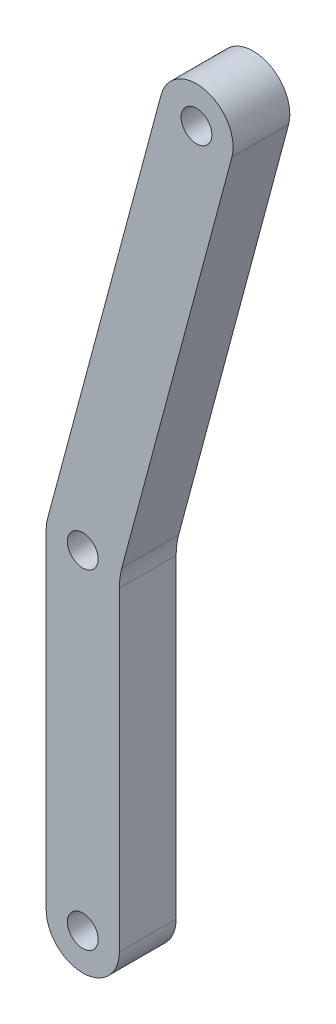
ISO-10303-21;
HEADER;
FILE_DESCRIPTION(('STEP AP214'),'2;1');
FILE_NAME('part.step','',(''),(''),'','','');
FILE_SCHEMA(('AUTOMOTIVE_DESIGN { 1 0 10303 214 1 1 1 1 }'));
ENDSEC;
DATA;
#1=APPLICATION_CONTEXT('core data for automotive mechanical design processes');
#2=APPLICATION_PROTOCOL_DEFINITION('international standard','automotive_design',2000,#1);
#3=PRODUCT_CONTEXT('',#1,'mechanical');
#4=PRODUCT('Part','Part','',(#3));
#5=PRODUCT_RELATED_PRODUCT_CATEGORY('part','',(#4));
#6=PRODUCT_DEFINITION_FORMATION('','',#4);
#7=PRODUCT_DEFINITION_CONTEXT('part definition',#1,'design');
#8=PRODUCT_DEFINITION('design','',#6,#7);
#9=PRODUCT_DEFINITION_SHAPE('','',#8);
#10=(LENGTH_UNIT() NAMED_UNIT(*) SI_UNIT(.MILLI.,.METRE.));
#11=(NAMED_UNIT(*) PLANE_ANGLE_UNIT() SI_UNIT($,.RADIAN.));
#12=(NAMED_UNIT(*) SI_UNIT($,.STERADIAN.) SOLID_ANGLE_UNIT());
#13=UNCERTAINTY_MEASURE_WITH_UNIT(LENGTH_MEASURE(1.E-05),#10,'distance_accuracy_value','');
#14=(GEOMETRIC_REPRESENTATION_CONTEXT(3) GLOBAL_UNCERTAINTY_ASSIGNED_CONTEXT((#13)) GLOBAL_UNIT_ASSIGNED_CONTEXT((#10,
#11,#12)) REPRESENTATION_CONTEXT('',''));
#15=CARTESIAN_POINT('',(0.,0.,0.));
#16=DIRECTION('',(0.,0.,1.));
#17=DIRECTION('',(1.,0.,0.));
#18=AXIS2_PLACEMENT_3D('',#15,#16,#17);
#19=CARTESIAN_POINT('',(-16.0796291314454,4.30852364036275,7.75));
#20=DIRECTION('',(-0.965925826289068,0.258819045102521,0.));
#21=DIRECTION('',(-0.258819045102521,-0.965925826289068,0.));
#22=AXIS2_PLACEMENT_3D('',#19,#20,#21);
#23=PLANE('',#22);
#24=DIRECTION('',(0.258819045102521,0.965925826289068,0.));
#25=VECTOR('',#24,1.);
#26=CARTESIAN_POINT('',(-16.0796291314454,4.30852364036275,0.));
#27=LINE('',#26,#25);
#28=CARTESIAN_POINT('',(-4.82962913144534,46.2940952255126,0.));
#29=VERTEX_POINT('',#28);
#30=CARTESIAN_POINT('',(10.6995135747059,104.249644802857,0.));
#31=VERTEX_POINT('',#30);
#32=EDGE_CURVE('E112',#29,#31,#27,.T.);
#33=ORIENTED_EDGE('',*,*,#32,.F.);
#34=DIRECTION('',(0.,0.,-1.));
#35=VECTOR('',#34,1.);
#36=CARTESIAN_POINT('',(-4.82962913144534,46.2940952255126,7.75));
#37=LINE('',#36,#35);
#38=CARTESIAN_POINT('',(-4.82962913144534,46.2940952255126,7.75));
#39=VERTEX_POINT('',#38);
#40=EDGE_CURVE('E107',#39,#29,#37,.T.);
#41=ORIENTED_EDGE('',*,*,#40,.F.);
#42=DIRECTION('',(0.258819045102521,0.965925826289068,0.));
#43=VECTOR('',#42,1.);
#44=CARTESIAN_POINT('',(-16.0796291314454,4.30852364036275,7.75));
#45=LINE('',#44,#43);
#46=CARTESIAN_POINT('',(10.6995135747059,104.249644802857,7.75));
#47=VERTEX_POINT('',#46);
#48=EDGE_CURVE('E110',#39,#47,#45,.T.);
#49=ORIENTED_EDGE('',*,*,#48,.T.);
#50=DIRECTION('',(0.,0.,-1.));
#51=VECTOR('',#50,1.);
#52=CARTESIAN_POINT('',(10.6995135747059,104.249644802857,7.75));
#53=LINE('',#52,#51);
#54=EDGE_CURVE('E167',#47,#31,#53,.T.);
#55=ORIENTED_EDGE('',*,*,#54,.T.);
#56=EDGE_LOOP('',(#33,#41,#49,#55));
#57=FACE_BOUND('',#56,.T.);
#58=ADVANCED_FACE('F41',(#57),#23,.T.);
#59=CARTESIAN_POINT('',(0.,45.,7.75));
#60=DIRECTION('',(0.,0.,-1.));
#61=DIRECTION('',(-1.,0.,0.));
#62=AXIS2_PLACEMENT_3D('',#59,#60,#61);
#63=CYLINDRICAL_SURFACE('',#62,5.);
#64=CARTESIAN_POINT('',(0.,45.,0.));
#65=DIRECTION('',(0.,0.,1.));
#66=DIRECTION('',(1.,0.,0.));
#67=AXIS2_PLACEMENT_3D('',#64,#65,#66);
#68=CIRCLE('',#67,5.);
#69=CARTESIAN_POINT('',(-5.,45.,0.));
#70=VERTEX_POINT('',#69);
#71=EDGE_CURVE('E170',#29,#70,#68,.T.);
#72=ORIENTED_EDGE('',*,*,#71,.T.);
#73=DIRECTION('',(0.,0.,-1.));
#74=VECTOR('',#73,1.);
#75=CARTESIAN_POINT('',(-5.,45.,7.75));
#76=LINE('',#75,#74);
#77=CARTESIAN_POINT('',(-5.,45.,7.75));
#78=VERTEX_POINT('',#77);
#79=EDGE_CURVE('E118',#78,#70,#76,.T.);
#80=ORIENTED_EDGE('',*,*,#79,.F.);
#81=CARTESIAN_POINT('',(0.,45.,7.75));
#82=DIRECTION('',(0.,0.,1.));
#83=DIRECTION('',(1.,0.,0.));
#84=AXIS2_PLACEMENT_3D('',#81,#82,#83);
#85=CIRCLE('',#84,5.);
#86=EDGE_CURVE('E121',#39,#78,#85,.T.);
#87=ORIENTED_EDGE('',*,*,#86,.F.);
#88=ORIENTED_EDGE('',*,*,#40,.T.);
#89=EDGE_LOOP('',(#72,#80,#87,#88));
#90=FACE_BOUND('',#89,.T.);
#91=ADVANCED_FACE('F122',(#90),#63,.T.);
#92=CARTESIAN_POINT('',(-5.,0.,7.75));
#93=DIRECTION('',(-1.,0.,0.));
#94=DIRECTION('',(0.,0.,1.));
#95=AXIS2_PLACEMENT_3D('',#92,#93,#94);
#96=PLANE('',#95);
#97=DIRECTION('',(0.,1.,0.));
#98=VECTOR('',#97,1.);
#99=CARTESIAN_POINT('',(-5.,0.,0.));
#100=LINE('',#99,#98);
#101=CARTESIAN_POINT('',(-5.,0.,0.));
#102=VERTEX_POINT('',#101);
#103=EDGE_CURVE('E173',#102,#70,#100,.T.);
#104=ORIENTED_EDGE('',*,*,#103,.F.);
#105=DIRECTION('',(0.,0.,-1.));
#106=VECTOR('',#105,1.);
#107=CARTESIAN_POINT('',(-5.,0.,7.75));
#108=LINE('',#107,#106);
#109=CARTESIAN_POINT('',(-5.,0.,7.75));
#110=VERTEX_POINT('',#109);
#111=EDGE_CURVE('E207',#110,#102,#108,.T.);
#112=ORIENTED_EDGE('',*,*,#111,.F.);
#113=DIRECTION('',(0.,1.,0.));
#114=VECTOR('',#113,1.);
#115=CARTESIAN_POINT('',(-5.,0.,7.75));
#116=LINE('',#115,#114);
#117=EDGE_CURVE('E127',#110,#78,#116,.T.);
#118=ORIENTED_EDGE('',*,*,#117,.T.);
#119=ORIENTED_EDGE('',*,*,#79,.T.);
#120=EDGE_LOOP('',(#104,#112,#118,#119));
#121=FACE_BOUND('',#120,.T.);
#122=ADVANCED_FACE('F247',(#121),#96,.T.);
#123=CARTESIAN_POINT('',(0.,0.,7.75));
#124=DIRECTION('',(0.,0.,-1.));
#125=DIRECTION('',(-1.,0.,0.));
#126=AXIS2_PLACEMENT_3D('',#123,#124,#125);
#127=CYLINDRICAL_SURFACE('',#126,5.);
#128=CARTESIAN_POINT('',(0.,0.,0.));
#129=DIRECTION('',(0.,0.,1.));
#130=DIRECTION('',(1.,0.,0.));
#131=AXIS2_PLACEMENT_3D('',#128,#129,#130);
#132=CIRCLE('',#131,5.);
#133=CARTESIAN_POINT('',(5.,0.,0.));
#134=VERTEX_POINT('',#133);
#135=EDGE_CURVE('E177',#102,#134,#132,.T.);
#136=ORIENTED_EDGE('',*,*,#135,.T.);
#137=DIRECTION('',(0.,0.,-1.));
#138=VECTOR('',#137,1.);
#139=CARTESIAN_POINT('',(5.,0.,7.75));
#140=LINE('',#139,#138);
#141=CARTESIAN_POINT('',(5.,0.,7.75));
#142=VERTEX_POINT('',#141);
#143=EDGE_CURVE('E203',#142,#134,#140,.T.);
#144=ORIENTED_EDGE('',*,*,#143,.F.);
#145=CARTESIAN_POINT('',(0.,0.,7.75));
#146=DIRECTION('',(0.,0.,1.));
#147=DIRECTION('',(1.,0.,0.));
#148=AXIS2_PLACEMENT_3D('',#145,#146,#147);
#149=CIRCLE('',#148,5.);
#150=EDGE_CURVE('E144',#110,#142,#149,.T.);
#151=ORIENTED_EDGE('',*,*,#150,.F.);
#152=ORIENTED_EDGE('',*,*,#111,.T.);
#153=EDGE_LOOP('',(#136,#144,#151,#152));
#154=FACE_BOUND('',#153,.T.);
#155=ADVANCED_FACE('F252',(#154),#127,.T.);
#156=CARTESIAN_POINT('',(5.,0.,7.75));
#157=DIRECTION('',(-1.,0.,0.));
#158=DIRECTION('',(0.,0.,1.));
#159=AXIS2_PLACEMENT_3D('',#156,#157,#158);
#160=PLANE('',#159);
#161=DIRECTION('',(0.,1.,0.));
#162=VECTOR('',#161,1.);
#163=CARTESIAN_POINT('',(5.,0.,0.));
#164=LINE('',#163,#162);
#165=CARTESIAN_POINT('',(5.,43.0252125361891,0.));
#166=VERTEX_POINT('',#165);
#167=EDGE_CURVE('E180',#134,#166,#164,.T.);
#168=ORIENTED_EDGE('',*,*,#167,.T.);
#169=DIRECTION('',(0.,0.,-1.));
#170=VECTOR('',#169,1.);
#171=CARTESIAN_POINT('',(5.,43.0252125361891,7.75));
#172=LINE('',#171,#170);
#173=CARTESIAN_POINT('',(5.,43.0252125361891,7.75));
#174=VERTEX_POINT('',#173);
#175=EDGE_CURVE('E57',#166,#174,#172,.F.);
#176=ORIENTED_EDGE('',*,*,#175,.T.);
#177=DIRECTION('',(0.,1.,0.));
#178=VECTOR('',#177,1.);
#179=CARTESIAN_POINT('',(5.,0.,7.75));
#180=LINE('',#179,#178);
#181=EDGE_CURVE('E147',#142,#174,#180,.T.);
#182=ORIENTED_EDGE('',*,*,#181,.F.);
#183=ORIENTED_EDGE('',*,*,#143,.T.);
#184=EDGE_LOOP('',(#168,#176,#182,#183));
#185=FACE_BOUND('',#184,.T.);
#186=ADVANCED_FACE('F256',(#185),#160,.F.);
#187=CARTESIAN_POINT('',(-6.42037086855468,1.72033318933754,7.75));
#188=DIRECTION('',(-0.965925826289068,0.258819045102521,0.));
#189=DIRECTION('',(-0.258819045102521,-0.965925826289068,0.));
#190=AXIS2_PLACEMENT_3D('',#187,#188,#189);
#191=PLANE('',#190);
#192=DIRECTION('',(0.258819045102521,0.965925826289068,0.));
#193=VECTOR('',#192,1.);
#194=CARTESIAN_POINT('',(-6.42037086855468,1.72033318933754,7.75));
#195=LINE('',#194,#193);
#196=CARTESIAN_POINT('',(5.34074173710932,45.6134029872143,7.75));
#197=VERTEX_POINT('',#196);
#198=CARTESIAN_POINT('',(20.3587718375966,101.661454351832,7.75));
#199=VERTEX_POINT('',#198);
#200=EDGE_CURVE('E150',#197,#199,#195,.T.);
#201=ORIENTED_EDGE('',*,*,#200,.F.);
#202=DIRECTION('',(0.,0.,-1.));
#203=VECTOR('',#202,1.);
#204=CARTESIAN_POINT('',(5.34074173710932,45.6134029872143,0.));
#205=LINE('',#204,#203);
#206=CARTESIAN_POINT('',(5.34074173710932,45.6134029872143,0.));
#207=VERTEX_POINT('',#206);
#208=EDGE_CURVE('E117',#197,#207,#205,.T.);
#209=ORIENTED_EDGE('',*,*,#208,.T.);
#210=DIRECTION('',(0.258819045102521,0.965925826289068,0.));
#211=VECTOR('',#210,1.);
#212=CARTESIAN_POINT('',(-6.42037086855468,1.72033318933754,0.));
#213=LINE('',#212,#211);
#214=CARTESIAN_POINT('',(20.3587718375966,101.661454351832,0.));
#215=VERTEX_POINT('',#214);
#216=EDGE_CURVE('E183',#207,#215,#213,.T.);
#217=ORIENTED_EDGE('',*,*,#216,.T.);
#218=DIRECTION('',(0.,0.,-1.));
#219=VECTOR('',#218,1.);
#220=CARTESIAN_POINT('',(20.3587718375966,101.661454351832,7.75));
#221=LINE('',#220,#219);
#222=EDGE_CURVE('E199',#199,#215,#221,.T.);
#223=ORIENTED_EDGE('',*,*,#222,.F.);
#224=EDGE_LOOP('',(#201,#209,#217,#223));
#225=FACE_BOUND('',#224,.T.);
#226=ADVANCED_FACE('F220',(#225),#191,.F.);
#227=CARTESIAN_POINT('',(0.,45.,7.75));
#228=DIRECTION('',(0.,0.,-1.));
#229=DIRECTION('',(-1.,0.,0.));
#230=AXIS2_PLACEMENT_3D('',#227,#228,#229);
#231=CYLINDRICAL_SURFACE('',#230,2.1);
#232=CARTESIAN_POINT('',(0.,45.,7.75));
#233=DIRECTION('',(0.,0.,1.));
#234=DIRECTION('',(1.,0.,0.));
#235=AXIS2_PLACEMENT_3D('',#232,#233,#234);
#236=CIRCLE('',#235,2.1);
#237=CARTESIAN_POINT('',(2.1,45.,7.75));
#238=VERTEX_POINT('',#237);
#239=EDGE_CURVE('E159',#238,#238,#236,.T.);
#240=ORIENTED_EDGE('',*,*,#239,.T.);
#241=EDGE_LOOP('',(#240));
#242=FACE_BOUND('',#241,.T.);
#243=CARTESIAN_POINT('',(0.,45.,0.));
#244=DIRECTION('',(0.,0.,1.));
#245=DIRECTION('',(1.,0.,0.));
#246=AXIS2_PLACEMENT_3D('',#243,#244,#245);
#247=CIRCLE('',#246,2.1);
#248=CARTESIAN_POINT('',(2.1,45.,0.));
#249=VERTEX_POINT('',#248);
#250=EDGE_CURVE('E139',#249,#249,#247,.T.);
#251=ORIENTED_EDGE('',*,*,#250,.F.);
#252=EDGE_LOOP('',(#251));
#253=FACE_BOUND('',#252,.T.);
#254=ADVANCED_FACE('F239',(#242,#253),#231,.F.);
#255=CARTESIAN_POINT('',(15.5291427061513,102.955549577344,7.75));
#256=DIRECTION('',(0.,0.,-1.));
#257=DIRECTION('',(-1.,0.,0.));
#258=AXIS2_PLACEMENT_3D('',#255,#256,#257);
#259=CYLINDRICAL_SURFACE('',#258,2.1);
#260=CARTESIAN_POINT('',(15.5291427061513,102.955549577344,7.75));
#261=DIRECTION('',(0.,0.,1.));
#262=DIRECTION('',(1.,0.,0.));
#263=AXIS2_PLACEMENT_3D('',#260,#261,#262);
#264=CIRCLE('',#263,2.1);
#265=CARTESIAN_POINT('',(17.6291427061513,102.955549577344,7.75));
#266=VERTEX_POINT('',#265);
#267=EDGE_CURVE('E155',#266,#266,#264,.T.);
#268=ORIENTED_EDGE('',*,*,#267,.T.);
#269=EDGE_LOOP('',(#268));
#270=FACE_BOUND('',#269,.T.);
#271=CARTESIAN_POINT('',(15.5291427061513,102.955549577344,0.));
#272=DIRECTION('',(0.,0.,1.));
#273=DIRECTION('',(1.,0.,0.));
#274=AXIS2_PLACEMENT_3D('',#271,#272,#273);
#275=CIRCLE('',#274,2.1);
#276=CARTESIAN_POINT('',(17.6291427061513,102.955549577344,0.));
#277=VERTEX_POINT('',#276);
#278=EDGE_CURVE('E190',#277,#277,#275,.T.);
#279=ORIENTED_EDGE('',*,*,#278,.F.);
#280=EDGE_LOOP('',(#279));
#281=FACE_BOUND('',#280,.T.);
#282=ADVANCED_FACE('F231',(#270,#281),#259,.F.);
#283=CARTESIAN_POINT('',(15.5291427061513,102.955549577344,7.75));
#284=DIRECTION('',(0.,0.,-1.));
#285=DIRECTION('',(-1.,0.,0.));
#286=AXIS2_PLACEMENT_3D('',#283,#284,#285);
#287=CYLINDRICAL_SURFACE('',#286,5.);
#288=CARTESIAN_POINT('',(15.5291427061513,102.955549577344,0.));
#289=DIRECTION('',(0.,0.,1.));
#290=DIRECTION('',(1.,0.,0.));
#291=AXIS2_PLACEMENT_3D('',#288,#289,#290);
#292=CIRCLE('',#291,5.);
#293=EDGE_CURVE('E186',#215,#31,#292,.T.);
#294=ORIENTED_EDGE('',*,*,#293,.T.);
#295=ORIENTED_EDGE('',*,*,#54,.F.);
#296=CARTESIAN_POINT('',(15.5291427061513,102.955549577344,7.75));
#297=DIRECTION('',(0.,0.,1.));
#298=DIRECTION('',(1.,0.,0.));
#299=AXIS2_PLACEMENT_3D('',#296,#297,#298);
#300=CIRCLE('',#299,5.);
#301=EDGE_CURVE('E132',#199,#47,#300,.T.);
#302=ORIENTED_EDGE('',*,*,#301,.F.);
#303=ORIENTED_EDGE('',*,*,#222,.T.);
#304=EDGE_LOOP('',(#294,#295,#302,#303));
#305=FACE_BOUND('',#304,.T.);
#306=ADVANCED_FACE('F228',(#305),#287,.T.);
#307=CARTESIAN_POINT('',(0.,0.,7.75));
#308=DIRECTION('',(0.,0.,-1.));
#309=DIRECTION('',(-1.,0.,0.));
#310=AXIS2_PLACEMENT_3D('',#307,#308,#309);
#311=CYLINDRICAL_SURFACE('',#310,2.1);
#312=CARTESIAN_POINT('',(0.,0.,7.75));
#313=DIRECTION('',(0.,0.,1.));
#314=DIRECTION('',(1.,0.,0.));
#315=AXIS2_PLACEMENT_3D('',#312,#313,#314);
#316=CIRCLE('',#315,2.1);
#317=CARTESIAN_POINT('',(2.1,0.,7.75));
#318=VERTEX_POINT('',#317);
#319=EDGE_CURVE('E163',#318,#318,#316,.T.);
#320=ORIENTED_EDGE('',*,*,#319,.T.);
#321=EDGE_LOOP('',(#320));
#322=FACE_BOUND('',#321,.T.);
#323=CARTESIAN_POINT('',(0.,0.,0.));
#324=DIRECTION('',(0.,0.,1.));
#325=DIRECTION('',(1.,0.,0.));
#326=AXIS2_PLACEMENT_3D('',#323,#324,#325);
#327=CIRCLE('',#326,2.1);
#328=CARTESIAN_POINT('',(2.1,0.,0.));
#329=VERTEX_POINT('',#328);
#330=EDGE_CURVE('E135',#329,#329,#327,.T.);
#331=ORIENTED_EDGE('',*,*,#330,.F.);
#332=EDGE_LOOP('',(#331));
#333=FACE_BOUND('',#332,.T.);
#334=ADVANCED_FACE('F230',(#322,#333),#311,.F.);
#335=CARTESIAN_POINT('',(0.,0.,7.75));
#336=DIRECTION('',(0.,0.,1.));
#337=DIRECTION('',(1.,0.,0.));
#338=AXIS2_PLACEMENT_3D('',#335,#336,#337);
#339=PLANE('',#338);
#340=ORIENTED_EDGE('',*,*,#48,.F.);
#341=ORIENTED_EDGE('',*,*,#86,.T.);
#342=ORIENTED_EDGE('',*,*,#117,.F.);
#343=ORIENTED_EDGE('',*,*,#150,.T.);
#344=ORIENTED_EDGE('',*,*,#181,.T.);
#345=CARTESIAN_POINT('',(15.,43.0252125361891,7.75));
#346=DIRECTION('',(0.,0.,1.));
#347=DIRECTION('',(1.,0.,0.));
#348=AXIS2_PLACEMENT_3D('',#345,#346,#347);
#349=CIRCLE('',#348,10.);
#350=EDGE_CURVE('E11',#174,#197,#349,.F.);
#351=ORIENTED_EDGE('',*,*,#350,.T.);
#352=ORIENTED_EDGE('',*,*,#200,.T.);
#353=ORIENTED_EDGE('',*,*,#301,.T.);
#354=EDGE_LOOP('',(#340,#341,#342,#343,#344,#351,#352,#353));
#355=FACE_BOUND('',#354,.T.);
#356=ORIENTED_EDGE('',*,*,#267,.F.);
#357=EDGE_LOOP('',(#356));
#358=FACE_BOUND('',#357,.T.);
#359=ORIENTED_EDGE('',*,*,#239,.F.);
#360=EDGE_LOOP('',(#359));
#361=FACE_BOUND('',#360,.T.);
#362=ORIENTED_EDGE('',*,*,#319,.F.);
#363=EDGE_LOOP('',(#362));
#364=FACE_BOUND('',#363,.T.);
#365=ADVANCED_FACE('F129',(#355,#358,#361,#364),#339,.T.);
#366=CARTESIAN_POINT('',(0.,0.,0.));
#367=DIRECTION('',(0.,0.,1.));
#368=DIRECTION('',(1.,0.,0.));
#369=AXIS2_PLACEMENT_3D('',#366,#367,#368);
#370=PLANE('',#369);
#371=ORIENTED_EDGE('',*,*,#32,.T.);
#372=ORIENTED_EDGE('',*,*,#293,.F.);
#373=ORIENTED_EDGE('',*,*,#216,.F.);
#374=CARTESIAN_POINT('',(15.,43.0252125361891,0.));
#375=DIRECTION('',(0.,0.,1.));
#376=DIRECTION('',(1.,0.,0.));
#377=AXIS2_PLACEMENT_3D('',#374,#375,#376);
#378=CIRCLE('',#377,10.);
#379=EDGE_CURVE('E50',#207,#166,#378,.T.);
#380=ORIENTED_EDGE('',*,*,#379,.T.);
#381=ORIENTED_EDGE('',*,*,#167,.F.);
#382=ORIENTED_EDGE('',*,*,#135,.F.);
#383=ORIENTED_EDGE('',*,*,#103,.T.);
#384=ORIENTED_EDGE('',*,*,#71,.F.);
#385=EDGE_LOOP('',(#371,#372,#373,#380,#381,#382,#383,#384));
#386=FACE_BOUND('',#385,.T.);
#387=ORIENTED_EDGE('',*,*,#278,.T.);
#388=EDGE_LOOP('',(#387));
#389=FACE_BOUND('',#388,.T.);
#390=ORIENTED_EDGE('',*,*,#250,.T.);
#391=EDGE_LOOP('',(#390));
#392=FACE_BOUND('',#391,.T.);
#393=ORIENTED_EDGE('',*,*,#330,.T.);
#394=EDGE_LOOP('',(#393));
#395=FACE_BOUND('',#394,.T.);
#396=ADVANCED_FACE('F225',(#386,#389,#392,#395),#370,.F.);
#397=CARTESIAN_POINT('',(15.,43.0252125361891,7.75));
#398=DIRECTION('',(0.,0.,1.));
#399=DIRECTION('',(1.,0.,0.));
#400=AXIS2_PLACEMENT_3D('',#397,#398,#399);
#401=CYLINDRICAL_SURFACE('',#400,10.);
#402=ORIENTED_EDGE('',*,*,#350,.F.);
#403=ORIENTED_EDGE('',*,*,#175,.F.);
#404=ORIENTED_EDGE('',*,*,#379,.F.);
#405=ORIENTED_EDGE('',*,*,#208,.F.);
#406=EDGE_LOOP('',(#402,#403,#404,#405));
#407=FACE_BOUND('',#406,.T.);
#408=ADVANCED_FACE('F43',(#407),#401,.F.);
#409=CLOSED_SHELL('',(#58,#91,#122,#155,#186,#226,#254,#282,#306,#334,#365,#396,#408));
#410=MANIFOLD_SOLID_BREP('B2',#409);
#411=ADVANCED_BREP_SHAPE_REPRESENTATION('',(#18,#410),#14);
#412=SHAPE_DEFINITION_REPRESENTATION(#9,#411);
ENDSEC;
END-ISO-10303-21;
